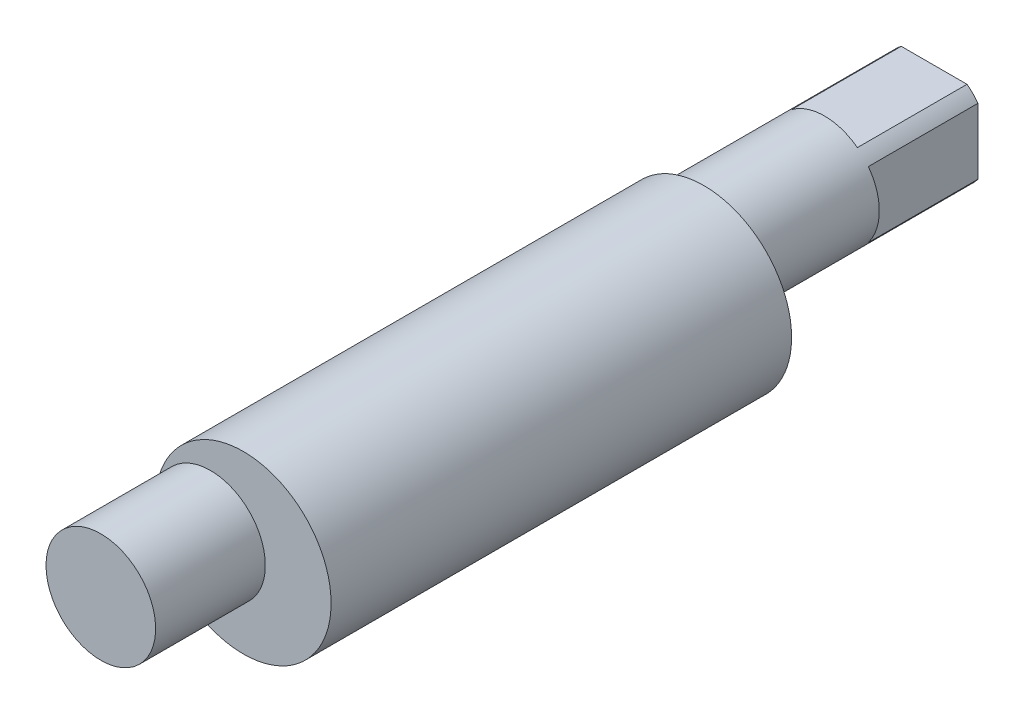
ISO-10303-21;
HEADER;
FILE_DESCRIPTION(('STEP AP214'),'2;1');
FILE_NAME('part.step','',(''),(''),'','','');
FILE_SCHEMA(('AUTOMOTIVE_DESIGN { 1 0 10303 214 1 1 1 1 }'));
ENDSEC;
DATA;
#1=APPLICATION_CONTEXT('core data for automotive mechanical design processes');
#2=APPLICATION_PROTOCOL_DEFINITION('international standard','automotive_design',2000,#1);
#3=PRODUCT_CONTEXT('',#1,'mechanical');
#4=PRODUCT('Part','Part','',(#3));
#5=PRODUCT_RELATED_PRODUCT_CATEGORY('part','',(#4));
#6=PRODUCT_DEFINITION_FORMATION('','',#4);
#7=PRODUCT_DEFINITION_CONTEXT('part definition',#1,'design');
#8=PRODUCT_DEFINITION('design','',#6,#7);
#9=PRODUCT_DEFINITION_SHAPE('','',#8);
#10=(LENGTH_UNIT() NAMED_UNIT(*) SI_UNIT(.MILLI.,.METRE.));
#11=(NAMED_UNIT(*) PLANE_ANGLE_UNIT() SI_UNIT($,.RADIAN.));
#12=(NAMED_UNIT(*) SI_UNIT($,.STERADIAN.) SOLID_ANGLE_UNIT());
#13=UNCERTAINTY_MEASURE_WITH_UNIT(LENGTH_MEASURE(1.E-05),#10,'distance_accuracy_value','');
#14=(GEOMETRIC_REPRESENTATION_CONTEXT(3) GLOBAL_UNCERTAINTY_ASSIGNED_CONTEXT((#13)) GLOBAL_UNIT_ASSIGNED_CONTEXT((#10,
#11,#12)) REPRESENTATION_CONTEXT('',''));
#15=CARTESIAN_POINT('',(0.,0.,0.));
#16=DIRECTION('',(0.,0.,1.));
#17=DIRECTION('',(1.,0.,0.));
#18=AXIS2_PLACEMENT_3D('',#15,#16,#17);
#19=CARTESIAN_POINT('',(-4.7625,0.,-38.1));
#20=DIRECTION('',(0.,0.,-1.));
#21=DIRECTION('',(-1.,0.,0.));
#22=AXIS2_PLACEMENT_3D('',#19,#20,#21);
#23=PLANE('',#22);
#24=CARTESIAN_POINT('',(-4.7625,0.,-38.1));
#25=DIRECTION('',(0.,0.,-1.));
#26=DIRECTION('',(-1.,0.,0.));
#27=AXIS2_PLACEMENT_3D('',#24,#25,#26);
#28=CIRCLE('',#27,7.9375);
#29=CARTESIAN_POINT('',(-9.525,-6.35,-38.1));
#30=VERTEX_POINT('',#29);
#31=CARTESIAN_POINT('',(-11.1125,-4.7625,-38.1));
#32=VERTEX_POINT('',#31);
#33=EDGE_CURVE('E30',#30,#32,#28,.T.);
#34=ORIENTED_EDGE('',*,*,#33,.T.);
#35=DIRECTION('',(0.,1.,0.));
#36=VECTOR('',#35,1.);
#37=CARTESIAN_POINT('',(-11.1125,0.,-38.1));
#38=LINE('',#37,#36);
#39=CARTESIAN_POINT('',(-11.1125,4.7625,-38.1));
#40=VERTEX_POINT('',#39);
#41=EDGE_CURVE('E205',#32,#40,#38,.T.);
#42=ORIENTED_EDGE('',*,*,#41,.T.);
#43=CARTESIAN_POINT('',(-4.7625,0.,-38.1));
#44=DIRECTION('',(0.,0.,-1.));
#45=DIRECTION('',(-1.,0.,0.));
#46=AXIS2_PLACEMENT_3D('',#43,#44,#45);
#47=CIRCLE('',#46,7.9375);
#48=CARTESIAN_POINT('',(-9.525,6.35,-38.1));
#49=VERTEX_POINT('',#48);
#50=EDGE_CURVE('E153',#40,#49,#47,.T.);
#51=ORIENTED_EDGE('',*,*,#50,.T.);
#52=DIRECTION('',(1.,0.,0.));
#53=VECTOR('',#52,1.);
#54=CARTESIAN_POINT('',(-4.7625,6.35,-38.1));
#55=LINE('',#54,#53);
#56=CARTESIAN_POINT('',(0.,6.35,-38.1));
#57=VERTEX_POINT('',#56);
#58=EDGE_CURVE('E103',#49,#57,#55,.T.);
#59=ORIENTED_EDGE('',*,*,#58,.T.);
#60=CARTESIAN_POINT('',(-4.7625,0.,-38.1));
#61=DIRECTION('',(0.,0.,-1.));
#62=DIRECTION('',(-1.,0.,0.));
#63=AXIS2_PLACEMENT_3D('',#60,#61,#62);
#64=CIRCLE('',#63,7.9375);
#65=CARTESIAN_POINT('',(1.5875,4.7625,-38.1));
#66=VERTEX_POINT('',#65);
#67=EDGE_CURVE('E147',#57,#66,#64,.T.);
#68=ORIENTED_EDGE('',*,*,#67,.T.);
#69=DIRECTION('',(0.,-1.,0.));
#70=VECTOR('',#69,1.);
#71=CARTESIAN_POINT('',(1.5875,0.,-38.1));
#72=LINE('',#71,#70);
#73=CARTESIAN_POINT('',(1.5875,-4.7625,-38.1));
#74=VERTEX_POINT('',#73);
#75=EDGE_CURVE('E128',#66,#74,#72,.T.);
#76=ORIENTED_EDGE('',*,*,#75,.T.);
#77=CARTESIAN_POINT('',(-4.7625,0.,-38.1));
#78=DIRECTION('',(0.,0.,-1.));
#79=DIRECTION('',(-1.,0.,0.));
#80=AXIS2_PLACEMENT_3D('',#77,#78,#79);
#81=CIRCLE('',#80,7.9375);
#82=CARTESIAN_POINT('',(0.,-6.35,-38.1));
#83=VERTEX_POINT('',#82);
#84=EDGE_CURVE('E11',#74,#83,#81,.T.);
#85=ORIENTED_EDGE('',*,*,#84,.T.);
#86=DIRECTION('',(-1.,0.,0.));
#87=VECTOR('',#86,1.);
#88=CARTESIAN_POINT('',(-4.7625,-6.35,-38.1));
#89=LINE('',#88,#87);
#90=EDGE_CURVE('E107',#83,#30,#89,.T.);
#91=ORIENTED_EDGE('',*,*,#90,.T.);
#92=EDGE_LOOP('',(#34,#42,#51,#59,#68,#76,#85,#91));
#93=FACE_BOUND('',#92,.T.);
#94=ADVANCED_FACE('F17',(#93),#23,.T.);
#95=CARTESIAN_POINT('',(12.7,0.,0.));
#96=DIRECTION('',(0.,0.,-1.));
#97=DIRECTION('',(-1.,0.,0.));
#98=AXIS2_PLACEMENT_3D('',#95,#96,#97);
#99=PLANE('',#98);
#100=CARTESIAN_POINT('',(0.,0.,0.));
#101=DIRECTION('',(0.,0.,1.));
#102=DIRECTION('',(1.,0.,0.));
#103=AXIS2_PLACEMENT_3D('',#100,#101,#102);
#104=CIRCLE('',#103,12.7);
#105=CARTESIAN_POINT('',(-12.7,0.,0.));
#106=VERTEX_POINT('',#105);
#107=EDGE_CURVE('E189',#106,#106,#104,.T.);
#108=ORIENTED_EDGE('',*,*,#107,.F.);
#109=CARTESIAN_POINT('',(-4.7625,0.,0.));
#110=DIRECTION('',(0.,0.,-1.));
#111=DIRECTION('',(-1.,0.,0.));
#112=AXIS2_PLACEMENT_3D('',#109,#110,#111);
#113=CIRCLE('',#112,7.9375);
#114=EDGE_CURVE('E196',#106,#106,#113,.T.);
#115=ORIENTED_EDGE('',*,*,#114,.F.);
#116=EDGE_LOOP('',(#108,#115));
#117=FACE_BOUND('',#116,.T.);
#118=ADVANCED_FACE('F19',(#117),#99,.T.);
#119=CARTESIAN_POINT('',(12.7,0.,66.675));
#120=DIRECTION('',(0.,0.,1.));
#121=DIRECTION('',(1.,0.,0.));
#122=AXIS2_PLACEMENT_3D('',#119,#120,#121);
#123=PLANE('',#122);
#124=CARTESIAN_POINT('',(-4.7625,0.,66.675));
#125=DIRECTION('',(0.,0.,1.));
#126=DIRECTION('',(1.,0.,0.));
#127=AXIS2_PLACEMENT_3D('',#124,#125,#126);
#128=CIRCLE('',#127,7.9375);
#129=CARTESIAN_POINT('',(-12.7,0.,66.675));
#130=VERTEX_POINT('',#129);
#131=EDGE_CURVE('E184',#130,#130,#128,.T.);
#132=ORIENTED_EDGE('',*,*,#131,.F.);
#133=CARTESIAN_POINT('',(0.,0.,66.675));
#134=DIRECTION('',(0.,0.,1.));
#135=DIRECTION('',(1.,0.,0.));
#136=AXIS2_PLACEMENT_3D('',#133,#134,#135);
#137=CIRCLE('',#136,12.7);
#138=EDGE_CURVE('E191',#130,#130,#137,.T.);
#139=ORIENTED_EDGE('',*,*,#138,.T.);
#140=EDGE_LOOP('',(#132,#139));
#141=FACE_BOUND('',#140,.T.);
#142=ADVANCED_FACE('F499',(#141),#123,.T.);
#143=CARTESIAN_POINT('',(-4.7625,0.,82.55));
#144=DIRECTION('',(0.,0.,-1.));
#145=DIRECTION('',(-1.,0.,0.));
#146=AXIS2_PLACEMENT_3D('',#143,#144,#145);
#147=PLANE('',#146);
#148=CARTESIAN_POINT('',(-4.7625,0.,82.55));
#149=DIRECTION('',(0.,0.,-1.));
#150=DIRECTION('',(-1.,0.,0.));
#151=AXIS2_PLACEMENT_3D('',#148,#149,#150);
#152=CIRCLE('',#151,7.9375);
#153=CARTESIAN_POINT('',(-12.7,0.,82.55));
#154=VERTEX_POINT('',#153);
#155=EDGE_CURVE('E181',#154,#154,#152,.T.);
#156=ORIENTED_EDGE('',*,*,#155,.F.);
#157=EDGE_LOOP('',(#156));
#158=FACE_BOUND('',#157,.T.);
#159=ADVANCED_FACE('F437',(#158),#147,.F.);
#160=CARTESIAN_POINT('',(1.5875,6.35,-22.225));
#161=DIRECTION('',(0.,1.,0.));
#162=DIRECTION('',(1.,0.,0.));
#163=AXIS2_PLACEMENT_3D('',#160,#161,#162);
#164=PLANE('',#163);
#165=ORIENTED_EDGE('',*,*,#58,.F.);
#166=DIRECTION('',(0.,0.,-1.));
#167=VECTOR('',#166,1.);
#168=CARTESIAN_POINT('',(-9.525,6.35,82.55));
#169=LINE('',#168,#167);
#170=CARTESIAN_POINT('',(-9.525,6.35,-22.225));
#171=VERTEX_POINT('',#170);
#172=EDGE_CURVE('E185',#171,#49,#169,.T.);
#173=ORIENTED_EDGE('',*,*,#172,.F.);
#174=DIRECTION('',(1.,0.,0.));
#175=VECTOR('',#174,1.);
#176=CARTESIAN_POINT('',(1.5875,6.35,-22.225));
#177=LINE('',#176,#175);
#178=CARTESIAN_POINT('',(0.,6.35,-22.225));
#179=VERTEX_POINT('',#178);
#180=EDGE_CURVE('E134',#171,#179,#177,.T.);
#181=ORIENTED_EDGE('',*,*,#180,.T.);
#182=DIRECTION('',(0.,0.,1.));
#183=VECTOR('',#182,1.);
#184=CARTESIAN_POINT('',(0.,6.35,82.55));
#185=LINE('',#184,#183);
#186=EDGE_CURVE('E159',#57,#179,#185,.T.);
#187=ORIENTED_EDGE('',*,*,#186,.F.);
#188=EDGE_LOOP('',(#165,#173,#181,#187));
#189=FACE_BOUND('',#188,.T.);
#190=ADVANCED_FACE('F161',(#189),#164,.T.);
#191=CARTESIAN_POINT('',(0.,0.,-22.225));
#192=DIRECTION('',(0.,0.,-1.));
#193=DIRECTION('',(-1.,0.,0.));
#194=AXIS2_PLACEMENT_3D('',#191,#192,#193);
#195=PLANE('',#194);
#196=ORIENTED_EDGE('',*,*,#180,.F.);
#197=CARTESIAN_POINT('',(-4.7625,0.,-22.225));
#198=DIRECTION('',(0.,0.,1.));
#199=DIRECTION('',(-1.,0.,0.));
#200=AXIS2_PLACEMENT_3D('',#197,#198,#199);
#201=CIRCLE('',#200,7.9375);
#202=EDGE_CURVE('E164',#179,#171,#201,.T.);
#203=ORIENTED_EDGE('',*,*,#202,.F.);
#204=EDGE_LOOP('',(#196,#203));
#205=FACE_BOUND('',#204,.T.);
#206=ADVANCED_FACE('F440',(#205),#195,.T.);
#207=CARTESIAN_POINT('',(1.5875,6.35,-22.225));
#208=DIRECTION('',(1.,0.,0.));
#209=DIRECTION('',(0.,0.,-1.));
#210=AXIS2_PLACEMENT_3D('',#207,#208,#209);
#211=PLANE('',#210);
#212=ORIENTED_EDGE('',*,*,#75,.F.);
#213=DIRECTION('',(0.,0.,-1.));
#214=VECTOR('',#213,1.);
#215=CARTESIAN_POINT('',(1.5875,4.7625,82.55));
#216=LINE('',#215,#214);
#217=CARTESIAN_POINT('',(1.5875,4.7625,-22.225));
#218=VERTEX_POINT('',#217);
#219=EDGE_CURVE('E166',#218,#66,#216,.T.);
#220=ORIENTED_EDGE('',*,*,#219,.F.);
#221=DIRECTION('',(0.,-1.,0.));
#222=VECTOR('',#221,1.);
#223=CARTESIAN_POINT('',(1.5875,6.35,-22.225));
#224=LINE('',#223,#222);
#225=CARTESIAN_POINT('',(1.5875,-4.7625,-22.225));
#226=VERTEX_POINT('',#225);
#227=EDGE_CURVE('E115',#218,#226,#224,.T.);
#228=ORIENTED_EDGE('',*,*,#227,.T.);
#229=DIRECTION('',(0.,0.,1.));
#230=VECTOR('',#229,1.);
#231=CARTESIAN_POINT('',(1.5875,-4.7625,82.55));
#232=LINE('',#231,#230);
#233=EDGE_CURVE('E129',#74,#226,#232,.T.);
#234=ORIENTED_EDGE('',*,*,#233,.F.);
#235=EDGE_LOOP('',(#212,#220,#228,#234));
#236=FACE_BOUND('',#235,.T.);
#237=ADVANCED_FACE('F457',(#236),#211,.T.);
#238=CARTESIAN_POINT('',(0.,0.,-22.225));
#239=DIRECTION('',(0.,0.,-1.));
#240=DIRECTION('',(-1.,0.,0.));
#241=AXIS2_PLACEMENT_3D('',#238,#239,#240);
#242=PLANE('',#241);
#243=ORIENTED_EDGE('',*,*,#227,.F.);
#244=CARTESIAN_POINT('',(-4.7625,0.,-22.225));
#245=DIRECTION('',(0.,0.,1.));
#246=DIRECTION('',(-1.,0.,0.));
#247=AXIS2_PLACEMENT_3D('',#244,#245,#246);
#248=CIRCLE('',#247,7.9375);
#249=EDGE_CURVE('E175',#226,#218,#248,.T.);
#250=ORIENTED_EDGE('',*,*,#249,.F.);
#251=EDGE_LOOP('',(#243,#250));
#252=FACE_BOUND('',#251,.T.);
#253=ADVANCED_FACE('F470',(#252),#242,.T.);
#254=CARTESIAN_POINT('',(1.5875,-6.35,-22.225));
#255=DIRECTION('',(0.,-1.,0.));
#256=DIRECTION('',(0.,0.,-1.));
#257=AXIS2_PLACEMENT_3D('',#254,#255,#256);
#258=PLANE('',#257);
#259=ORIENTED_EDGE('',*,*,#90,.F.);
#260=DIRECTION('',(0.,0.,-1.));
#261=VECTOR('',#260,1.);
#262=CARTESIAN_POINT('',(0.,-6.35,82.55));
#263=LINE('',#262,#261);
#264=CARTESIAN_POINT('',(0.,-6.35,-22.225));
#265=VERTEX_POINT('',#264);
#266=EDGE_CURVE('E114',#265,#83,#263,.T.);
#267=ORIENTED_EDGE('',*,*,#266,.F.);
#268=DIRECTION('',(-1.,0.,0.));
#269=VECTOR('',#268,1.);
#270=CARTESIAN_POINT('',(1.5875,-6.35,-22.225));
#271=LINE('',#270,#269);
#272=CARTESIAN_POINT('',(-9.525,-6.35,-22.225));
#273=VERTEX_POINT('',#272);
#274=EDGE_CURVE('E109',#265,#273,#271,.T.);
#275=ORIENTED_EDGE('',*,*,#274,.T.);
#276=DIRECTION('',(0.,0.,1.));
#277=VECTOR('',#276,1.);
#278=CARTESIAN_POINT('',(-9.525,-6.35,82.55));
#279=LINE('',#278,#277);
#280=EDGE_CURVE('E94',#30,#273,#279,.T.);
#281=ORIENTED_EDGE('',*,*,#280,.F.);
#282=EDGE_LOOP('',(#259,#267,#275,#281));
#283=FACE_BOUND('',#282,.T.);
#284=ADVANCED_FACE('F110',(#283),#258,.T.);
#285=CARTESIAN_POINT('',(0.,0.,-22.225));
#286=DIRECTION('',(0.,0.,-1.));
#287=DIRECTION('',(-1.,0.,0.));
#288=AXIS2_PLACEMENT_3D('',#285,#286,#287);
#289=PLANE('',#288);
#290=ORIENTED_EDGE('',*,*,#274,.F.);
#291=CARTESIAN_POINT('',(-4.7625,0.,-22.225));
#292=DIRECTION('',(0.,0.,1.));
#293=DIRECTION('',(-1.,0.,0.));
#294=AXIS2_PLACEMENT_3D('',#291,#292,#293);
#295=CIRCLE('',#294,7.9375);
#296=EDGE_CURVE('E117',#273,#265,#295,.T.);
#297=ORIENTED_EDGE('',*,*,#296,.F.);
#298=EDGE_LOOP('',(#290,#297));
#299=FACE_BOUND('',#298,.T.);
#300=ADVANCED_FACE('F410',(#299),#289,.T.);
#301=CARTESIAN_POINT('',(0.,0.,-22.225));
#302=DIRECTION('',(0.,0.,-1.));
#303=DIRECTION('',(-1.,0.,0.));
#304=AXIS2_PLACEMENT_3D('',#301,#302,#303);
#305=PLANE('',#304);
#306=DIRECTION('',(0.,1.,0.));
#307=VECTOR('',#306,1.);
#308=CARTESIAN_POINT('',(-11.1125,6.35,-22.225));
#309=LINE('',#308,#307);
#310=CARTESIAN_POINT('',(-11.1125,-4.7625,-22.225));
#311=VERTEX_POINT('',#310);
#312=CARTESIAN_POINT('',(-11.1125,4.7625,-22.225));
#313=VERTEX_POINT('',#312);
#314=EDGE_CURVE('E209',#311,#313,#309,.T.);
#315=ORIENTED_EDGE('',*,*,#314,.F.);
#316=CARTESIAN_POINT('',(-4.7625,0.,-22.225));
#317=DIRECTION('',(0.,0.,1.));
#318=DIRECTION('',(-1.,0.,0.));
#319=AXIS2_PLACEMENT_3D('',#316,#317,#318);
#320=CIRCLE('',#319,7.9375);
#321=EDGE_CURVE('E200',#313,#311,#320,.T.);
#322=ORIENTED_EDGE('',*,*,#321,.F.);
#323=EDGE_LOOP('',(#315,#322));
#324=FACE_BOUND('',#323,.T.);
#325=ADVANCED_FACE('F405',(#324),#305,.T.);
#326=CARTESIAN_POINT('',(-11.1125,6.35,-22.225));
#327=DIRECTION('',(-1.,0.,0.));
#328=DIRECTION('',(0.,0.,1.));
#329=AXIS2_PLACEMENT_3D('',#326,#327,#328);
#330=PLANE('',#329);
#331=ORIENTED_EDGE('',*,*,#41,.F.);
#332=DIRECTION('',(0.,0.,-1.));
#333=VECTOR('',#332,1.);
#334=CARTESIAN_POINT('',(-11.1125,-4.7625,82.55));
#335=LINE('',#334,#333);
#336=EDGE_CURVE('E100',#311,#32,#335,.T.);
#337=ORIENTED_EDGE('',*,*,#336,.F.);
#338=ORIENTED_EDGE('',*,*,#314,.T.);
#339=DIRECTION('',(0.,0.,1.));
#340=VECTOR('',#339,1.);
#341=CARTESIAN_POINT('',(-11.1125,4.7625,82.55));
#342=LINE('',#341,#340);
#343=EDGE_CURVE('E179',#40,#313,#342,.T.);
#344=ORIENTED_EDGE('',*,*,#343,.F.);
#345=EDGE_LOOP('',(#331,#337,#338,#344));
#346=FACE_BOUND('',#345,.T.);
#347=ADVANCED_FACE('F406',(#346),#330,.T.);
#348=CARTESIAN_POINT('',(-4.7625,0.,82.55));
#349=DIRECTION('',(0.,0.,-1.));
#350=DIRECTION('',(-1.,0.,0.));
#351=AXIS2_PLACEMENT_3D('',#348,#349,#350);
#352=CYLINDRICAL_SURFACE('',#351,7.9375);
#353=ORIENTED_EDGE('',*,*,#233,.T.);
#354=ORIENTED_EDGE('',*,*,#249,.T.);
#355=ORIENTED_EDGE('',*,*,#219,.T.);
#356=ORIENTED_EDGE('',*,*,#67,.F.);
#357=ORIENTED_EDGE('',*,*,#186,.T.);
#358=ORIENTED_EDGE('',*,*,#202,.T.);
#359=ORIENTED_EDGE('',*,*,#172,.T.);
#360=ORIENTED_EDGE('',*,*,#50,.F.);
#361=ORIENTED_EDGE('',*,*,#343,.T.);
#362=ORIENTED_EDGE('',*,*,#321,.T.);
#363=ORIENTED_EDGE('',*,*,#336,.T.);
#364=ORIENTED_EDGE('',*,*,#33,.F.);
#365=ORIENTED_EDGE('',*,*,#280,.T.);
#366=ORIENTED_EDGE('',*,*,#296,.T.);
#367=ORIENTED_EDGE('',*,*,#266,.T.);
#368=ORIENTED_EDGE('',*,*,#84,.F.);
#369=EDGE_LOOP('',(#353,#354,#355,#356,#357,#358,#359,#360,#361,#362,#363,#364,#365,#366,#367,#368));
#370=FACE_BOUND('',#369,.T.);
#371=ORIENTED_EDGE('',*,*,#114,.T.);
#372=EDGE_LOOP('',(#371));
#373=FACE_BOUND('',#372,.T.);
#374=ADVANCED_FACE('F93',(#370,#373),#352,.T.);
#375=CARTESIAN_POINT('',(0.,0.,0.));
#376=DIRECTION('',(0.,0.,1.));
#377=DIRECTION('',(1.,0.,0.));
#378=AXIS2_PLACEMENT_3D('',#375,#376,#377);
#379=CYLINDRICAL_SURFACE('',#378,12.7);
#380=ORIENTED_EDGE('',*,*,#138,.F.);
#381=EDGE_LOOP('',(#380));
#382=FACE_BOUND('',#381,.T.);
#383=ORIENTED_EDGE('',*,*,#107,.T.);
#384=EDGE_LOOP('',(#383));
#385=FACE_BOUND('',#384,.T.);
#386=ADVANCED_FACE('F372',(#382,#385),#379,.T.);
#387=CARTESIAN_POINT('',(-4.7625,0.,82.55));
#388=DIRECTION('',(0.,0.,-1.));
#389=DIRECTION('',(-1.,0.,0.));
#390=AXIS2_PLACEMENT_3D('',#387,#388,#389);
#391=CYLINDRICAL_SURFACE('',#390,7.9375);
#392=ORIENTED_EDGE('',*,*,#131,.T.);
#393=EDGE_LOOP('',(#392));
#394=FACE_BOUND('',#393,.T.);
#395=ORIENTED_EDGE('',*,*,#155,.T.);
#396=EDGE_LOOP('',(#395));
#397=FACE_BOUND('',#396,.T.);
#398=ADVANCED_FACE('F367',(#394,#397),#391,.T.);
#399=CLOSED_SHELL('',(#94,#118,#142,#159,#190,#206,#237,#253,#284,#300,#325,#347,#374,#386,#398));
#400=MANIFOLD_SOLID_BREP('B1',#399);
#401=ADVANCED_BREP_SHAPE_REPRESENTATION('',(#18,#400),#14);
#402=SHAPE_DEFINITION_REPRESENTATION(#9,#401);
ENDSEC;
END-ISO-10303-21;
